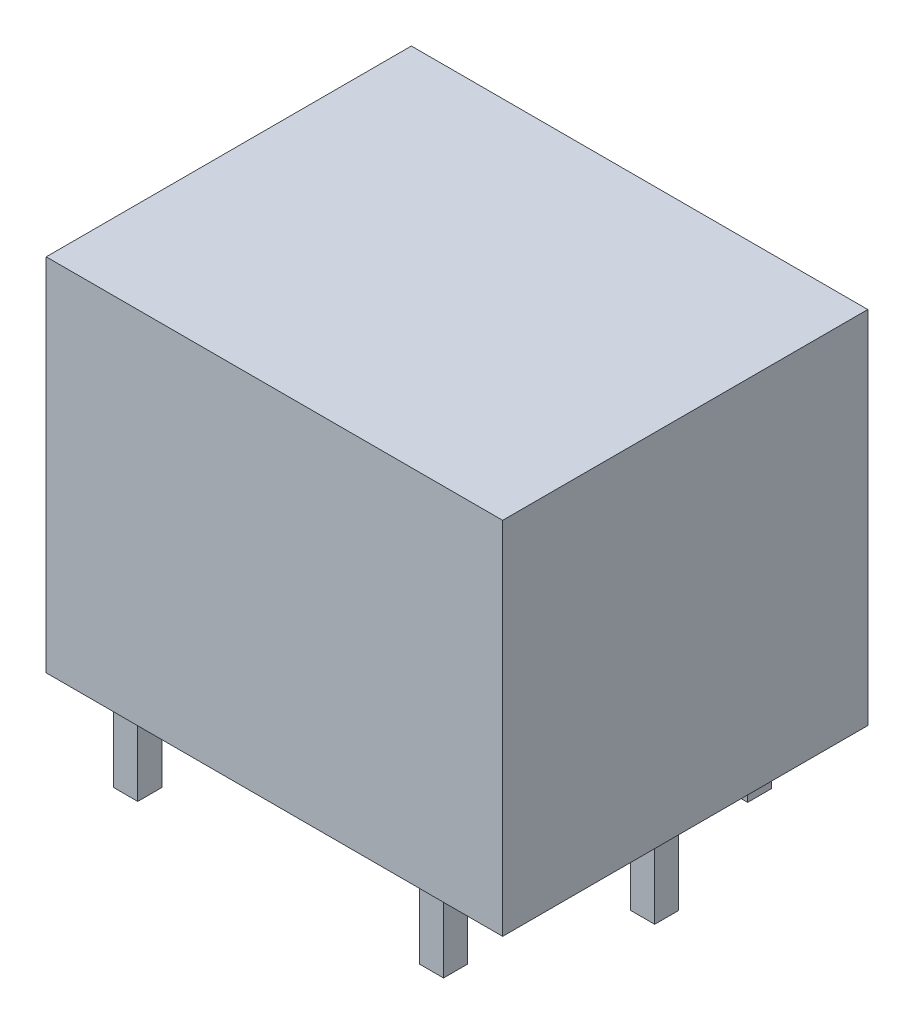
ISO-10303-21;
HEADER;
FILE_DESCRIPTION(('STEP AP214'),'2;1');
FILE_NAME('part.step','',(''),(''),'','','');
FILE_SCHEMA(('AUTOMOTIVE_DESIGN { 1 0 10303 214 1 1 1 1 }'));
ENDSEC;
DATA;
#1=APPLICATION_CONTEXT('core data for automotive mechanical design processes');
#2=APPLICATION_PROTOCOL_DEFINITION('international standard','automotive_design',2000,#1);
#3=PRODUCT_CONTEXT('',#1,'mechanical');
#4=PRODUCT('Part','Part','',(#3));
#5=PRODUCT_RELATED_PRODUCT_CATEGORY('part','',(#4));
#6=PRODUCT_DEFINITION_FORMATION('','',#4);
#7=PRODUCT_DEFINITION_CONTEXT('part definition',#1,'design');
#8=PRODUCT_DEFINITION('design','',#6,#7);
#9=PRODUCT_DEFINITION_SHAPE('','',#8);
#10=(LENGTH_UNIT() NAMED_UNIT(*) SI_UNIT(.MILLI.,.METRE.));
#11=(NAMED_UNIT(*) PLANE_ANGLE_UNIT() SI_UNIT($,.RADIAN.));
#12=(NAMED_UNIT(*) SI_UNIT($,.STERADIAN.) SOLID_ANGLE_UNIT());
#13=UNCERTAINTY_MEASURE_WITH_UNIT(LENGTH_MEASURE(1.E-05),#10,'distance_accuracy_value','');
#14=(GEOMETRIC_REPRESENTATION_CONTEXT(3) GLOBAL_UNCERTAINTY_ASSIGNED_CONTEXT((#13)) GLOBAL_UNIT_ASSIGNED_CONTEXT((#10,
#11,#12)) REPRESENTATION_CONTEXT('',''));
#15=CARTESIAN_POINT('',(0.,0.,0.));
#16=DIRECTION('',(0.,0.,1.));
#17=DIRECTION('',(1.,0.,0.));
#18=AXIS2_PLACEMENT_3D('',#15,#16,#17);
#19=CARTESIAN_POINT('',(-9.49999999999999,0.,7.6));
#20=DIRECTION('',(0.,1.,0.));
#21=DIRECTION('',(0.,0.,1.));
#22=AXIS2_PLACEMENT_3D('',#19,#20,#21);
#23=PLANE('',#22);
#24=DIRECTION('',(1.,0.,0.));
#25=VECTOR('',#24,1.);
#26=CARTESIAN_POINT('',(-6.45999999999999,0.,-6.83));
#27=LINE('',#26,#25);
#28=CARTESIAN_POINT('',(-7.45999999999999,0.,-6.83));
#29=VERTEX_POINT('',#28);
#30=CARTESIAN_POINT('',(-6.45999999999999,0.,-6.83));
#31=VERTEX_POINT('',#30);
#32=EDGE_CURVE('E221',#29,#31,#27,.T.);
#33=ORIENTED_EDGE('',*,*,#32,.F.);
#34=DIRECTION('',(0.,0.,-1.));
#35=VECTOR('',#34,1.);
#36=CARTESIAN_POINT('',(-7.45999999999999,0.,-6.83));
#37=LINE('',#36,#35);
#38=CARTESIAN_POINT('',(-7.45999999999999,0.,-5.83));
#39=VERTEX_POINT('',#38);
#40=EDGE_CURVE('E230',#39,#29,#37,.T.);
#41=ORIENTED_EDGE('',*,*,#40,.F.);
#42=DIRECTION('',(-1.,0.,0.));
#43=VECTOR('',#42,1.);
#44=CARTESIAN_POINT('',(-6.45999999999999,0.,-5.83));
#45=LINE('',#44,#43);
#46=CARTESIAN_POINT('',(-6.45999999999999,0.,-5.83));
#47=VERTEX_POINT('',#46);
#48=EDGE_CURVE('E227',#47,#39,#45,.T.);
#49=ORIENTED_EDGE('',*,*,#48,.F.);
#50=DIRECTION('',(0.,0.,1.));
#51=VECTOR('',#50,1.);
#52=CARTESIAN_POINT('',(-6.45999999999999,0.,-6.83));
#53=LINE('',#52,#51);
#54=EDGE_CURVE('E224',#31,#47,#53,.T.);
#55=ORIENTED_EDGE('',*,*,#54,.F.);
#56=EDGE_LOOP('',(#33,#41,#49,#55));
#57=FACE_BOUND('',#56,.T.);
#58=DIRECTION('',(0.,0.,1.));
#59=VECTOR('',#58,1.);
#60=CARTESIAN_POINT('',(6.27000000000001,0.,6.83));
#61=LINE('',#60,#59);
#62=CARTESIAN_POINT('',(6.27000000000001,0.,5.83));
#63=VERTEX_POINT('',#62);
#64=CARTESIAN_POINT('',(6.27,0.,6.83));
#65=VERTEX_POINT('',#64);
#66=EDGE_CURVE('E287',#63,#65,#61,.T.);
#67=ORIENTED_EDGE('',*,*,#66,.F.);
#68=DIRECTION('',(1.,0.,0.));
#69=VECTOR('',#68,1.);
#70=CARTESIAN_POINT('',(6.27000000000001,0.,5.83));
#71=LINE('',#70,#69);
#72=CARTESIAN_POINT('',(5.27000000000001,0.,5.83));
#73=VERTEX_POINT('',#72);
#74=EDGE_CURVE('E296',#73,#63,#71,.T.);
#75=ORIENTED_EDGE('',*,*,#74,.F.);
#76=DIRECTION('',(0.,0.,-1.));
#77=VECTOR('',#76,1.);
#78=CARTESIAN_POINT('',(5.27000000000001,0.,6.83));
#79=LINE('',#78,#77);
#80=CARTESIAN_POINT('',(5.27,0.,6.83));
#81=VERTEX_POINT('',#80);
#82=EDGE_CURVE('E293',#81,#73,#79,.T.);
#83=ORIENTED_EDGE('',*,*,#82,.F.);
#84=DIRECTION('',(-1.,0.,0.));
#85=VECTOR('',#84,1.);
#86=CARTESIAN_POINT('',(6.27000000000001,0.,6.83));
#87=LINE('',#86,#85);
#88=EDGE_CURVE('E290',#65,#81,#87,.T.);
#89=ORIENTED_EDGE('',*,*,#88,.F.);
#90=EDGE_LOOP('',(#67,#75,#83,#89));
#91=FACE_BOUND('',#90,.T.);
#92=DIRECTION('',(0.,0.,1.));
#93=VECTOR('',#92,1.);
#94=CARTESIAN_POINT('',(-9.49999999999999,0.,-7.6));
#95=LINE('',#94,#93);
#96=CARTESIAN_POINT('',(-9.49999999999999,0.,-7.6));
#97=VERTEX_POINT('',#96);
#98=CARTESIAN_POINT('',(-9.49999999999999,0.,7.6));
#99=VERTEX_POINT('',#98);
#100=EDGE_CURVE('E353',#97,#99,#95,.T.);
#101=ORIENTED_EDGE('',*,*,#100,.F.);
#102=DIRECTION('',(-1.,0.,0.));
#103=VECTOR('',#102,1.);
#104=CARTESIAN_POINT('',(-9.49999999999999,0.,-7.6));
#105=LINE('',#104,#103);
#106=CARTESIAN_POINT('',(9.5,0.,-7.6));
#107=VERTEX_POINT('',#106);
#108=EDGE_CURVE('E360',#107,#97,#105,.T.);
#109=ORIENTED_EDGE('',*,*,#108,.F.);
#110=DIRECTION('',(0.,0.,-1.));
#111=VECTOR('',#110,1.);
#112=CARTESIAN_POINT('',(9.5,0.,-7.6));
#113=LINE('',#112,#111);
#114=CARTESIAN_POINT('',(9.50000000000001,0.,7.6));
#115=VERTEX_POINT('',#114);
#116=EDGE_CURVE('E358',#115,#107,#113,.T.);
#117=ORIENTED_EDGE('',*,*,#116,.F.);
#118=DIRECTION('',(1.,0.,0.));
#119=VECTOR('',#118,1.);
#120=CARTESIAN_POINT('',(-9.49999999999999,0.,7.6));
#121=LINE('',#120,#119);
#122=EDGE_CURVE('E356',#99,#115,#121,.T.);
#123=ORIENTED_EDGE('',*,*,#122,.F.);
#124=EDGE_LOOP('',(#101,#109,#117,#123));
#125=FACE_BOUND('',#124,.T.);
#126=DIRECTION('',(0.,0.,1.));
#127=VECTOR('',#126,1.);
#128=CARTESIAN_POINT('',(8.73000000000001,0.,-0.499999999999999));
#129=LINE('',#128,#127);
#130=CARTESIAN_POINT('',(8.73000000000001,0.,-0.499999999999999));
#131=VERTEX_POINT('',#130);
#132=CARTESIAN_POINT('',(8.73,0.,0.500000000000008));
#133=VERTEX_POINT('',#132);
#134=EDGE_CURVE('E320',#131,#133,#129,.T.);
#135=ORIENTED_EDGE('',*,*,#134,.F.);
#136=DIRECTION('',(1.,0.,0.));
#137=VECTOR('',#136,1.);
#138=CARTESIAN_POINT('',(8.73000000000001,0.,-0.499999999999999));
#139=LINE('',#138,#137);
#140=CARTESIAN_POINT('',(7.73,0.,-0.5));
#141=VERTEX_POINT('',#140);
#142=EDGE_CURVE('E329',#141,#131,#139,.T.);
#143=ORIENTED_EDGE('',*,*,#142,.F.);
#144=DIRECTION('',(0.,0.,-1.));
#145=VECTOR('',#144,1.);
#146=CARTESIAN_POINT('',(7.73,0.,-0.499999999999999));
#147=LINE('',#146,#145);
#148=CARTESIAN_POINT('',(7.73,0.,0.500000000000008));
#149=VERTEX_POINT('',#148);
#150=EDGE_CURVE('E326',#149,#141,#147,.T.);
#151=ORIENTED_EDGE('',*,*,#150,.F.);
#152=DIRECTION('',(-1.,0.,0.));
#153=VECTOR('',#152,1.);
#154=CARTESIAN_POINT('',(8.73000000000001,0.,0.500000000000008));
#155=LINE('',#154,#153);
#156=EDGE_CURVE('E323',#133,#149,#155,.T.);
#157=ORIENTED_EDGE('',*,*,#156,.F.);
#158=EDGE_LOOP('',(#135,#143,#151,#157));
#159=FACE_BOUND('',#158,.T.);
#160=DIRECTION('',(0.,0.,1.));
#161=VECTOR('',#160,1.);
#162=CARTESIAN_POINT('',(-6.45999999999999,0.,6.83));
#163=LINE('',#162,#161);
#164=CARTESIAN_POINT('',(-6.45999999999999,0.,5.83));
#165=VERTEX_POINT('',#164);
#166=CARTESIAN_POINT('',(-6.45999999999999,0.,6.83));
#167=VERTEX_POINT('',#166);
#168=EDGE_CURVE('E254',#165,#167,#163,.T.);
#169=ORIENTED_EDGE('',*,*,#168,.F.);
#170=DIRECTION('',(1.,0.,0.));
#171=VECTOR('',#170,1.);
#172=CARTESIAN_POINT('',(-6.45999999999999,0.,5.83));
#173=LINE('',#172,#171);
#174=CARTESIAN_POINT('',(-7.45999999999999,0.,5.83));
#175=VERTEX_POINT('',#174);
#176=EDGE_CURVE('E263',#175,#165,#173,.T.);
#177=ORIENTED_EDGE('',*,*,#176,.F.);
#178=DIRECTION('',(0.,0.,-1.));
#179=VECTOR('',#178,1.);
#180=CARTESIAN_POINT('',(-7.45999999999999,0.,6.83));
#181=LINE('',#180,#179);
#182=CARTESIAN_POINT('',(-7.45999999999999,0.,6.83));
#183=VERTEX_POINT('',#182);
#184=EDGE_CURVE('E260',#183,#175,#181,.T.);
#185=ORIENTED_EDGE('',*,*,#184,.F.);
#186=DIRECTION('',(-1.,0.,0.));
#187=VECTOR('',#186,1.);
#188=CARTESIAN_POINT('',(-6.45999999999999,0.,6.83));
#189=LINE('',#188,#187);
#190=EDGE_CURVE('E257',#167,#183,#189,.T.);
#191=ORIENTED_EDGE('',*,*,#190,.F.);
#192=EDGE_LOOP('',(#169,#177,#185,#191));
#193=FACE_BOUND('',#192,.T.);
#194=DIRECTION('',(1.,0.,0.));
#195=VECTOR('',#194,1.);
#196=CARTESIAN_POINT('',(6.27000000000001,0.,-6.83));
#197=LINE('',#196,#195);
#198=CARTESIAN_POINT('',(5.27000000000001,0.,-6.83));
#199=VERTEX_POINT('',#198);
#200=CARTESIAN_POINT('',(6.27,0.,-6.83));
#201=VERTEX_POINT('',#200);
#202=EDGE_CURVE('E189',#199,#201,#197,.T.);
#203=ORIENTED_EDGE('',*,*,#202,.F.);
#204=DIRECTION('',(0.,0.,-1.));
#205=VECTOR('',#204,1.);
#206=CARTESIAN_POINT('',(5.27000000000001,0.,-6.83));
#207=LINE('',#206,#205);
#208=CARTESIAN_POINT('',(5.27,0.,-5.83));
#209=VERTEX_POINT('',#208);
#210=EDGE_CURVE('E191',#209,#199,#207,.T.);
#211=ORIENTED_EDGE('',*,*,#210,.F.);
#212=DIRECTION('',(-1.,0.,0.));
#213=VECTOR('',#212,1.);
#214=CARTESIAN_POINT('',(6.27000000000001,0.,-5.83));
#215=LINE('',#214,#213);
#216=CARTESIAN_POINT('',(6.27,0.,-5.83));
#217=VERTEX_POINT('',#216);
#218=EDGE_CURVE('E52',#217,#209,#215,.T.);
#219=ORIENTED_EDGE('',*,*,#218,.F.);
#220=DIRECTION('',(0.,0.,1.));
#221=VECTOR('',#220,1.);
#222=CARTESIAN_POINT('',(6.27000000000001,0.,-6.83));
#223=LINE('',#222,#221);
#224=EDGE_CURVE('E47',#201,#217,#223,.T.);
#225=ORIENTED_EDGE('',*,*,#224,.F.);
#226=EDGE_LOOP('',(#203,#211,#219,#225));
#227=FACE_BOUND('',#226,.T.);
#228=ADVANCED_FACE('F32',(#57,#91,#125,#159,#193,#227),#23,.F.);
#229=CARTESIAN_POINT('',(-9.49999999999999,15.,-7.6));
#230=DIRECTION('',(1.,0.,0.));
#231=DIRECTION('',(0.,0.,-1.));
#232=AXIS2_PLACEMENT_3D('',#229,#230,#231);
#233=PLANE('',#232);
#234=ORIENTED_EDGE('',*,*,#100,.T.);
#235=DIRECTION('',(0.,-1.,0.));
#236=VECTOR('',#235,1.);
#237=CARTESIAN_POINT('',(-9.49999999999999,15.,7.6));
#238=LINE('',#237,#236);
#239=CARTESIAN_POINT('',(-9.49999999999999,15.,7.6));
#240=VERTEX_POINT('',#239);
#241=EDGE_CURVE('E11',#240,#99,#238,.T.);
#242=ORIENTED_EDGE('',*,*,#241,.F.);
#243=DIRECTION('',(0.,0.,1.));
#244=VECTOR('',#243,1.);
#245=CARTESIAN_POINT('',(-9.49999999999999,15.,-7.6));
#246=LINE('',#245,#244);
#247=CARTESIAN_POINT('',(-9.49999999999999,15.,-7.6));
#248=VERTEX_POINT('',#247);
#249=EDGE_CURVE('E362',#248,#240,#246,.T.);
#250=ORIENTED_EDGE('',*,*,#249,.F.);
#251=DIRECTION('',(0.,-1.,0.));
#252=VECTOR('',#251,1.);
#253=CARTESIAN_POINT('',(-9.49999999999999,15.,-7.6));
#254=LINE('',#253,#252);
#255=EDGE_CURVE('E371',#248,#97,#254,.T.);
#256=ORIENTED_EDGE('',*,*,#255,.T.);
#257=EDGE_LOOP('',(#234,#242,#250,#256));
#258=FACE_BOUND('',#257,.T.);
#259=ADVANCED_FACE('F34',(#258),#233,.F.);
#260=CARTESIAN_POINT('',(-9.49999999999999,15.,7.6));
#261=DIRECTION('',(0.,0.,-1.));
#262=DIRECTION('',(-1.,0.,0.));
#263=AXIS2_PLACEMENT_3D('',#260,#261,#262);
#264=PLANE('',#263);
#265=ORIENTED_EDGE('',*,*,#122,.T.);
#266=DIRECTION('',(0.,-1.,0.));
#267=VECTOR('',#266,1.);
#268=CARTESIAN_POINT('',(9.50000000000001,15.,7.6));
#269=LINE('',#268,#267);
#270=CARTESIAN_POINT('',(9.50000000000001,15.,7.6));
#271=VERTEX_POINT('',#270);
#272=EDGE_CURVE('E40',#271,#115,#269,.T.);
#273=ORIENTED_EDGE('',*,*,#272,.F.);
#274=DIRECTION('',(1.,0.,0.));
#275=VECTOR('',#274,1.);
#276=CARTESIAN_POINT('',(-9.49999999999999,15.,7.6));
#277=LINE('',#276,#275);
#278=EDGE_CURVE('E365',#240,#271,#277,.T.);
#279=ORIENTED_EDGE('',*,*,#278,.F.);
#280=ORIENTED_EDGE('',*,*,#241,.T.);
#281=EDGE_LOOP('',(#265,#273,#279,#280));
#282=FACE_BOUND('',#281,.T.);
#283=ADVANCED_FACE('F397',(#282),#264,.F.);
#284=CARTESIAN_POINT('',(9.5,15.,-7.6));
#285=DIRECTION('',(-1.,0.,0.));
#286=DIRECTION('',(0.,0.,1.));
#287=AXIS2_PLACEMENT_3D('',#284,#285,#286);
#288=PLANE('',#287);
#289=ORIENTED_EDGE('',*,*,#116,.T.);
#290=DIRECTION('',(0.,-1.,0.));
#291=VECTOR('',#290,1.);
#292=CARTESIAN_POINT('',(9.5,15.,-7.6));
#293=LINE('',#292,#291);
#294=CARTESIAN_POINT('',(9.5,15.,-7.6));
#295=VERTEX_POINT('',#294);
#296=EDGE_CURVE('E374',#295,#107,#293,.T.);
#297=ORIENTED_EDGE('',*,*,#296,.F.);
#298=DIRECTION('',(0.,0.,-1.));
#299=VECTOR('',#298,1.);
#300=CARTESIAN_POINT('',(9.5,15.,-7.6));
#301=LINE('',#300,#299);
#302=EDGE_CURVE('E367',#271,#295,#301,.T.);
#303=ORIENTED_EDGE('',*,*,#302,.F.);
#304=ORIENTED_EDGE('',*,*,#272,.T.);
#305=EDGE_LOOP('',(#289,#297,#303,#304));
#306=FACE_BOUND('',#305,.T.);
#307=ADVANCED_FACE('F381',(#306),#288,.F.);
#308=CARTESIAN_POINT('',(-9.49999999999999,15.,-7.6));
#309=DIRECTION('',(0.,0.,1.));
#310=DIRECTION('',(1.,0.,0.));
#311=AXIS2_PLACEMENT_3D('',#308,#309,#310);
#312=PLANE('',#311);
#313=ORIENTED_EDGE('',*,*,#108,.T.);
#314=ORIENTED_EDGE('',*,*,#255,.F.);
#315=DIRECTION('',(-1.,0.,0.));
#316=VECTOR('',#315,1.);
#317=CARTESIAN_POINT('',(-9.49999999999999,15.,-7.6));
#318=LINE('',#317,#316);
#319=EDGE_CURVE('E369',#295,#248,#318,.T.);
#320=ORIENTED_EDGE('',*,*,#319,.F.);
#321=ORIENTED_EDGE('',*,*,#296,.T.);
#322=EDGE_LOOP('',(#313,#314,#320,#321));
#323=FACE_BOUND('',#322,.T.);
#324=ADVANCED_FACE('F390',(#323),#312,.F.);
#325=CARTESIAN_POINT('',(-9.49999999999999,15.,7.6));
#326=DIRECTION('',(0.,1.,0.));
#327=DIRECTION('',(0.,0.,1.));
#328=AXIS2_PLACEMENT_3D('',#325,#326,#327);
#329=PLANE('',#328);
#330=ORIENTED_EDGE('',*,*,#249,.T.);
#331=ORIENTED_EDGE('',*,*,#278,.T.);
#332=ORIENTED_EDGE('',*,*,#302,.T.);
#333=ORIENTED_EDGE('',*,*,#319,.T.);
#334=EDGE_LOOP('',(#330,#331,#332,#333));
#335=FACE_BOUND('',#334,.T.);
#336=ADVANCED_FACE('F396',(#335),#329,.T.);
#337=CARTESIAN_POINT('',(8.73000000000001,-3.5,-0.499999999999999));
#338=DIRECTION('',(-1.,0.,0.));
#339=DIRECTION('',(0.,0.,1.));
#340=AXIS2_PLACEMENT_3D('',#337,#338,#339);
#341=PLANE('',#340);
#342=ORIENTED_EDGE('',*,*,#134,.T.);
#343=DIRECTION('',(0.,1.,0.));
#344=VECTOR('',#343,1.);
#345=CARTESIAN_POINT('',(8.73000000000001,-3.5,0.500000000000008));
#346=LINE('',#345,#344);
#347=CARTESIAN_POINT('',(8.73000000000001,-3.5,0.500000000000008));
#348=VERTEX_POINT('',#347);
#349=EDGE_CURVE('E350',#348,#133,#346,.T.);
#350=ORIENTED_EDGE('',*,*,#349,.F.);
#351=DIRECTION('',(0.,0.,1.));
#352=VECTOR('',#351,1.);
#353=CARTESIAN_POINT('',(8.73000000000001,-3.5,-0.499999999999999));
#354=LINE('',#353,#352);
#355=CARTESIAN_POINT('',(8.73000000000001,-3.5,-0.499999999999999));
#356=VERTEX_POINT('',#355);
#357=EDGE_CURVE('E332',#356,#348,#354,.T.);
#358=ORIENTED_EDGE('',*,*,#357,.F.);
#359=DIRECTION('',(0.,1.,0.));
#360=VECTOR('',#359,1.);
#361=CARTESIAN_POINT('',(8.73000000000001,-3.5,-0.499999999999999));
#362=LINE('',#361,#360);
#363=EDGE_CURVE('E341',#356,#131,#362,.T.);
#364=ORIENTED_EDGE('',*,*,#363,.T.);
#365=EDGE_LOOP('',(#342,#350,#358,#364));
#366=FACE_BOUND('',#365,.T.);
#367=ADVANCED_FACE('F412',(#366),#341,.F.);
#368=CARTESIAN_POINT('',(8.73000000000001,-3.5,0.500000000000008));
#369=DIRECTION('',(0.,0.,-1.));
#370=DIRECTION('',(-1.,0.,0.));
#371=AXIS2_PLACEMENT_3D('',#368,#369,#370);
#372=PLANE('',#371);
#373=ORIENTED_EDGE('',*,*,#156,.T.);
#374=DIRECTION('',(0.,1.,0.));
#375=VECTOR('',#374,1.);
#376=CARTESIAN_POINT('',(7.73000000000001,-3.5,0.500000000000008));
#377=LINE('',#376,#375);
#378=CARTESIAN_POINT('',(7.73000000000001,-3.5,0.500000000000008));
#379=VERTEX_POINT('',#378);
#380=EDGE_CURVE('E347',#379,#149,#377,.T.);
#381=ORIENTED_EDGE('',*,*,#380,.F.);
#382=DIRECTION('',(-1.,0.,0.));
#383=VECTOR('',#382,1.);
#384=CARTESIAN_POINT('',(8.73000000000001,-3.5,0.500000000000008));
#385=LINE('',#384,#383);
#386=EDGE_CURVE('E335',#348,#379,#385,.T.);
#387=ORIENTED_EDGE('',*,*,#386,.F.);
#388=ORIENTED_EDGE('',*,*,#349,.T.);
#389=EDGE_LOOP('',(#373,#381,#387,#388));
#390=FACE_BOUND('',#389,.T.);
#391=ADVANCED_FACE('F431',(#390),#372,.F.);
#392=CARTESIAN_POINT('',(7.73,-3.5,-0.499999999999999));
#393=DIRECTION('',(1.,0.,0.));
#394=DIRECTION('',(0.,0.,-1.));
#395=AXIS2_PLACEMENT_3D('',#392,#393,#394);
#396=PLANE('',#395);
#397=ORIENTED_EDGE('',*,*,#150,.T.);
#398=DIRECTION('',(0.,1.,0.));
#399=VECTOR('',#398,1.);
#400=CARTESIAN_POINT('',(7.73,-3.5,-0.499999999999999));
#401=LINE('',#400,#399);
#402=CARTESIAN_POINT('',(7.73,-3.5,-0.499999999999999));
#403=VERTEX_POINT('',#402);
#404=EDGE_CURVE('E344',#403,#141,#401,.T.);
#405=ORIENTED_EDGE('',*,*,#404,.F.);
#406=DIRECTION('',(0.,0.,-1.));
#407=VECTOR('',#406,1.);
#408=CARTESIAN_POINT('',(7.73,-3.5,-0.499999999999999));
#409=LINE('',#408,#407);
#410=EDGE_CURVE('E337',#379,#403,#409,.T.);
#411=ORIENTED_EDGE('',*,*,#410,.F.);
#412=ORIENTED_EDGE('',*,*,#380,.T.);
#413=EDGE_LOOP('',(#397,#405,#411,#412));
#414=FACE_BOUND('',#413,.T.);
#415=ADVANCED_FACE('F438',(#414),#396,.F.);
#416=CARTESIAN_POINT('',(8.73000000000001,-3.5,-0.499999999999999));
#417=DIRECTION('',(0.,0.,1.));
#418=DIRECTION('',(1.,0.,0.));
#419=AXIS2_PLACEMENT_3D('',#416,#417,#418);
#420=PLANE('',#419);
#421=ORIENTED_EDGE('',*,*,#142,.T.);
#422=ORIENTED_EDGE('',*,*,#363,.F.);
#423=DIRECTION('',(1.,0.,0.));
#424=VECTOR('',#423,1.);
#425=CARTESIAN_POINT('',(8.73000000000001,-3.5,-0.499999999999999));
#426=LINE('',#425,#424);
#427=EDGE_CURVE('E339',#403,#356,#426,.T.);
#428=ORIENTED_EDGE('',*,*,#427,.F.);
#429=ORIENTED_EDGE('',*,*,#404,.T.);
#430=EDGE_LOOP('',(#421,#422,#428,#429));
#431=FACE_BOUND('',#430,.T.);
#432=ADVANCED_FACE('F445',(#431),#420,.F.);
#433=CARTESIAN_POINT('',(8.73000000000001,-3.5,0.500000000000008));
#434=DIRECTION('',(0.,-1.,0.));
#435=DIRECTION('',(0.,0.,-1.));
#436=AXIS2_PLACEMENT_3D('',#433,#434,#435);
#437=PLANE('',#436);
#438=ORIENTED_EDGE('',*,*,#357,.T.);
#439=ORIENTED_EDGE('',*,*,#386,.T.);
#440=ORIENTED_EDGE('',*,*,#410,.T.);
#441=ORIENTED_EDGE('',*,*,#427,.T.);
#442=EDGE_LOOP('',(#438,#439,#440,#441));
#443=FACE_BOUND('',#442,.T.);
#444=ADVANCED_FACE('F453',(#443),#437,.T.);
#445=CARTESIAN_POINT('',(6.27000000000001,-3.5,6.83));
#446=DIRECTION('',(-1.,0.,0.));
#447=DIRECTION('',(0.,0.,1.));
#448=AXIS2_PLACEMENT_3D('',#445,#446,#447);
#449=PLANE('',#448);
#450=ORIENTED_EDGE('',*,*,#66,.T.);
#451=DIRECTION('',(0.,1.,0.));
#452=VECTOR('',#451,1.);
#453=CARTESIAN_POINT('',(6.27000000000001,-3.5,6.83));
#454=LINE('',#453,#452);
#455=CARTESIAN_POINT('',(6.27000000000001,-3.5,6.83));
#456=VERTEX_POINT('',#455);
#457=EDGE_CURVE('E317',#456,#65,#454,.T.);
#458=ORIENTED_EDGE('',*,*,#457,.F.);
#459=DIRECTION('',(0.,0.,1.));
#460=VECTOR('',#459,1.);
#461=CARTESIAN_POINT('',(6.27000000000001,-3.5,6.83));
#462=LINE('',#461,#460);
#463=CARTESIAN_POINT('',(6.27000000000001,-3.5,5.83));
#464=VERTEX_POINT('',#463);
#465=EDGE_CURVE('E299',#464,#456,#462,.T.);
#466=ORIENTED_EDGE('',*,*,#465,.F.);
#467=DIRECTION('',(0.,1.,0.));
#468=VECTOR('',#467,1.);
#469=CARTESIAN_POINT('',(6.27000000000001,-3.5,5.83));
#470=LINE('',#469,#468);
#471=EDGE_CURVE('E308',#464,#63,#470,.T.);
#472=ORIENTED_EDGE('',*,*,#471,.T.);
#473=EDGE_LOOP('',(#450,#458,#466,#472));
#474=FACE_BOUND('',#473,.T.);
#475=ADVANCED_FACE('F461',(#474),#449,.F.);
#476=CARTESIAN_POINT('',(6.27000000000001,-3.5,6.83));
#477=DIRECTION('',(0.,0.,-1.));
#478=DIRECTION('',(-1.,0.,0.));
#479=AXIS2_PLACEMENT_3D('',#476,#477,#478);
#480=PLANE('',#479);
#481=ORIENTED_EDGE('',*,*,#88,.T.);
#482=DIRECTION('',(0.,1.,0.));
#483=VECTOR('',#482,1.);
#484=CARTESIAN_POINT('',(5.27000000000001,-3.5,6.83));
#485=LINE('',#484,#483);
#486=CARTESIAN_POINT('',(5.27000000000001,-3.5,6.83));
#487=VERTEX_POINT('',#486);
#488=EDGE_CURVE('E314',#487,#81,#485,.T.);
#489=ORIENTED_EDGE('',*,*,#488,.F.);
#490=DIRECTION('',(-1.,0.,0.));
#491=VECTOR('',#490,1.);
#492=CARTESIAN_POINT('',(6.27000000000001,-3.5,6.83));
#493=LINE('',#492,#491);
#494=EDGE_CURVE('E302',#456,#487,#493,.T.);
#495=ORIENTED_EDGE('',*,*,#494,.F.);
#496=ORIENTED_EDGE('',*,*,#457,.T.);
#497=EDGE_LOOP('',(#481,#489,#495,#496));
#498=FACE_BOUND('',#497,.T.);
#499=ADVANCED_FACE('F469',(#498),#480,.F.);
#500=CARTESIAN_POINT('',(5.27000000000001,-3.5,6.83));
#501=DIRECTION('',(1.,0.,0.));
#502=DIRECTION('',(0.,0.,-1.));
#503=AXIS2_PLACEMENT_3D('',#500,#501,#502);
#504=PLANE('',#503);
#505=ORIENTED_EDGE('',*,*,#82,.T.);
#506=DIRECTION('',(0.,1.,0.));
#507=VECTOR('',#506,1.);
#508=CARTESIAN_POINT('',(5.27,-3.5,5.83));
#509=LINE('',#508,#507);
#510=CARTESIAN_POINT('',(5.27,-3.5,5.83));
#511=VERTEX_POINT('',#510);
#512=EDGE_CURVE('E311',#511,#73,#509,.T.);
#513=ORIENTED_EDGE('',*,*,#512,.F.);
#514=DIRECTION('',(0.,0.,-1.));
#515=VECTOR('',#514,1.);
#516=CARTESIAN_POINT('',(5.27000000000001,-3.5,6.83));
#517=LINE('',#516,#515);
#518=EDGE_CURVE('E304',#487,#511,#517,.T.);
#519=ORIENTED_EDGE('',*,*,#518,.F.);
#520=ORIENTED_EDGE('',*,*,#488,.T.);
#521=EDGE_LOOP('',(#505,#513,#519,#520));
#522=FACE_BOUND('',#521,.T.);
#523=ADVANCED_FACE('F477',(#522),#504,.F.);
#524=CARTESIAN_POINT('',(6.27000000000001,-3.5,5.83));
#525=DIRECTION('',(0.,0.,1.));
#526=DIRECTION('',(1.,0.,0.));
#527=AXIS2_PLACEMENT_3D('',#524,#525,#526);
#528=PLANE('',#527);
#529=ORIENTED_EDGE('',*,*,#74,.T.);
#530=ORIENTED_EDGE('',*,*,#471,.F.);
#531=DIRECTION('',(1.,0.,0.));
#532=VECTOR('',#531,1.);
#533=CARTESIAN_POINT('',(6.27000000000001,-3.5,5.83));
#534=LINE('',#533,#532);
#535=EDGE_CURVE('E306',#511,#464,#534,.T.);
#536=ORIENTED_EDGE('',*,*,#535,.F.);
#537=ORIENTED_EDGE('',*,*,#512,.T.);
#538=EDGE_LOOP('',(#529,#530,#536,#537));
#539=FACE_BOUND('',#538,.T.);
#540=ADVANCED_FACE('F485',(#539),#528,.F.);
#541=CARTESIAN_POINT('',(6.27000000000001,-3.5,5.83));
#542=DIRECTION('',(0.,1.,0.));
#543=DIRECTION('',(0.,0.,1.));
#544=AXIS2_PLACEMENT_3D('',#541,#542,#543);
#545=PLANE('',#544);
#546=ORIENTED_EDGE('',*,*,#465,.T.);
#547=ORIENTED_EDGE('',*,*,#494,.T.);
#548=ORIENTED_EDGE('',*,*,#518,.T.);
#549=ORIENTED_EDGE('',*,*,#535,.T.);
#550=EDGE_LOOP('',(#546,#547,#548,#549));
#551=FACE_BOUND('',#550,.T.);
#552=ADVANCED_FACE('F493',(#551),#545,.F.);
#553=CARTESIAN_POINT('',(-6.45999999999999,-3.5,6.83));
#554=DIRECTION('',(-1.,0.,0.));
#555=DIRECTION('',(0.,0.,1.));
#556=AXIS2_PLACEMENT_3D('',#553,#554,#555);
#557=PLANE('',#556);
#558=ORIENTED_EDGE('',*,*,#168,.T.);
#559=DIRECTION('',(0.,1.,0.));
#560=VECTOR('',#559,1.);
#561=CARTESIAN_POINT('',(-6.45999999999999,-3.5,6.83));
#562=LINE('',#561,#560);
#563=CARTESIAN_POINT('',(-6.45999999999999,-3.5,6.83));
#564=VERTEX_POINT('',#563);
#565=EDGE_CURVE('E284',#564,#167,#562,.T.);
#566=ORIENTED_EDGE('',*,*,#565,.F.);
#567=DIRECTION('',(0.,0.,1.));
#568=VECTOR('',#567,1.);
#569=CARTESIAN_POINT('',(-6.45999999999999,-3.5,6.83));
#570=LINE('',#569,#568);
#571=CARTESIAN_POINT('',(-6.45999999999999,-3.5,5.83));
#572=VERTEX_POINT('',#571);
#573=EDGE_CURVE('E266',#572,#564,#570,.T.);
#574=ORIENTED_EDGE('',*,*,#573,.F.);
#575=DIRECTION('',(0.,1.,0.));
#576=VECTOR('',#575,1.);
#577=CARTESIAN_POINT('',(-6.45999999999999,-3.5,5.83));
#578=LINE('',#577,#576);
#579=EDGE_CURVE('E275',#572,#165,#578,.T.);
#580=ORIENTED_EDGE('',*,*,#579,.T.);
#581=EDGE_LOOP('',(#558,#566,#574,#580));
#582=FACE_BOUND('',#581,.T.);
#583=ADVANCED_FACE('F501',(#582),#557,.F.);
#584=CARTESIAN_POINT('',(-6.45999999999999,-3.5,6.83));
#585=DIRECTION('',(0.,0.,-1.));
#586=DIRECTION('',(-1.,0.,0.));
#587=AXIS2_PLACEMENT_3D('',#584,#585,#586);
#588=PLANE('',#587);
#589=ORIENTED_EDGE('',*,*,#190,.T.);
#590=DIRECTION('',(0.,1.,0.));
#591=VECTOR('',#590,1.);
#592=CARTESIAN_POINT('',(-7.45999999999999,-3.5,6.83));
#593=LINE('',#592,#591);
#594=CARTESIAN_POINT('',(-7.45999999999999,-3.5,6.83));
#595=VERTEX_POINT('',#594);
#596=EDGE_CURVE('E281',#595,#183,#593,.T.);
#597=ORIENTED_EDGE('',*,*,#596,.F.);
#598=DIRECTION('',(-1.,0.,0.));
#599=VECTOR('',#598,1.);
#600=CARTESIAN_POINT('',(-6.45999999999999,-3.5,6.83));
#601=LINE('',#600,#599);
#602=EDGE_CURVE('E269',#564,#595,#601,.T.);
#603=ORIENTED_EDGE('',*,*,#602,.F.);
#604=ORIENTED_EDGE('',*,*,#565,.T.);
#605=EDGE_LOOP('',(#589,#597,#603,#604));
#606=FACE_BOUND('',#605,.T.);
#607=ADVANCED_FACE('F509',(#606),#588,.F.);
#608=CARTESIAN_POINT('',(-7.45999999999999,-3.5,6.83));
#609=DIRECTION('',(1.,0.,0.));
#610=DIRECTION('',(0.,0.,-1.));
#611=AXIS2_PLACEMENT_3D('',#608,#609,#610);
#612=PLANE('',#611);
#613=ORIENTED_EDGE('',*,*,#184,.T.);
#614=DIRECTION('',(0.,1.,0.));
#615=VECTOR('',#614,1.);
#616=CARTESIAN_POINT('',(-7.45999999999999,-3.5,5.83));
#617=LINE('',#616,#615);
#618=CARTESIAN_POINT('',(-7.45999999999999,-3.5,5.83));
#619=VERTEX_POINT('',#618);
#620=EDGE_CURVE('E278',#619,#175,#617,.T.);
#621=ORIENTED_EDGE('',*,*,#620,.F.);
#622=DIRECTION('',(0.,0.,-1.));
#623=VECTOR('',#622,1.);
#624=CARTESIAN_POINT('',(-7.45999999999999,-3.5,6.83));
#625=LINE('',#624,#623);
#626=EDGE_CURVE('E271',#595,#619,#625,.T.);
#627=ORIENTED_EDGE('',*,*,#626,.F.);
#628=ORIENTED_EDGE('',*,*,#596,.T.);
#629=EDGE_LOOP('',(#613,#621,#627,#628));
#630=FACE_BOUND('',#629,.T.);
#631=ADVANCED_FACE('F517',(#630),#612,.F.);
#632=CARTESIAN_POINT('',(-6.45999999999999,-3.5,5.83));
#633=DIRECTION('',(0.,0.,1.));
#634=DIRECTION('',(1.,0.,0.));
#635=AXIS2_PLACEMENT_3D('',#632,#633,#634);
#636=PLANE('',#635);
#637=ORIENTED_EDGE('',*,*,#176,.T.);
#638=ORIENTED_EDGE('',*,*,#579,.F.);
#639=DIRECTION('',(1.,0.,0.));
#640=VECTOR('',#639,1.);
#641=CARTESIAN_POINT('',(-6.45999999999999,-3.5,5.83));
#642=LINE('',#641,#640);
#643=EDGE_CURVE('E273',#619,#572,#642,.T.);
#644=ORIENTED_EDGE('',*,*,#643,.F.);
#645=ORIENTED_EDGE('',*,*,#620,.T.);
#646=EDGE_LOOP('',(#637,#638,#644,#645));
#647=FACE_BOUND('',#646,.T.);
#648=ADVANCED_FACE('F525',(#647),#636,.F.);
#649=CARTESIAN_POINT('',(-6.45999999999999,-3.5,5.83));
#650=DIRECTION('',(0.,1.,0.));
#651=DIRECTION('',(0.,0.,1.));
#652=AXIS2_PLACEMENT_3D('',#649,#650,#651);
#653=PLANE('',#652);
#654=ORIENTED_EDGE('',*,*,#573,.T.);
#655=ORIENTED_EDGE('',*,*,#602,.T.);
#656=ORIENTED_EDGE('',*,*,#626,.T.);
#657=ORIENTED_EDGE('',*,*,#643,.T.);
#658=EDGE_LOOP('',(#654,#655,#656,#657));
#659=FACE_BOUND('',#658,.T.);
#660=ADVANCED_FACE('F533',(#659),#653,.F.);
#661=CARTESIAN_POINT('',(-6.45999999999999,-3.5,-6.83));
#662=DIRECTION('',(0.,0.,1.));
#663=DIRECTION('',(1.,0.,0.));
#664=AXIS2_PLACEMENT_3D('',#661,#662,#663);
#665=PLANE('',#664);
#666=ORIENTED_EDGE('',*,*,#32,.T.);
#667=DIRECTION('',(0.,1.,0.));
#668=VECTOR('',#667,1.);
#669=CARTESIAN_POINT('',(-6.45999999999999,-3.5,-6.83));
#670=LINE('',#669,#668);
#671=CARTESIAN_POINT('',(-6.45999999999999,-3.5,-6.83));
#672=VERTEX_POINT('',#671);
#673=EDGE_CURVE('E251',#672,#31,#670,.T.);
#674=ORIENTED_EDGE('',*,*,#673,.F.);
#675=DIRECTION('',(1.,0.,0.));
#676=VECTOR('',#675,1.);
#677=CARTESIAN_POINT('',(-6.45999999999999,-3.5,-6.83));
#678=LINE('',#677,#676);
#679=CARTESIAN_POINT('',(-7.45999999999999,-3.5,-6.83));
#680=VERTEX_POINT('',#679);
#681=EDGE_CURVE('E233',#680,#672,#678,.T.);
#682=ORIENTED_EDGE('',*,*,#681,.F.);
#683=DIRECTION('',(0.,1.,0.));
#684=VECTOR('',#683,1.);
#685=CARTESIAN_POINT('',(-7.45999999999999,-3.5,-6.83));
#686=LINE('',#685,#684);
#687=EDGE_CURVE('E242',#680,#29,#686,.T.);
#688=ORIENTED_EDGE('',*,*,#687,.T.);
#689=EDGE_LOOP('',(#666,#674,#682,#688));
#690=FACE_BOUND('',#689,.T.);
#691=ADVANCED_FACE('F541',(#690),#665,.F.);
#692=CARTESIAN_POINT('',(-6.45999999999999,-3.5,-6.83));
#693=DIRECTION('',(-1.,0.,0.));
#694=DIRECTION('',(0.,0.,1.));
#695=AXIS2_PLACEMENT_3D('',#692,#693,#694);
#696=PLANE('',#695);
#697=ORIENTED_EDGE('',*,*,#54,.T.);
#698=DIRECTION('',(0.,1.,0.));
#699=VECTOR('',#698,1.);
#700=CARTESIAN_POINT('',(-6.45999999999999,-3.5,-5.83));
#701=LINE('',#700,#699);
#702=CARTESIAN_POINT('',(-6.45999999999999,-3.5,-5.83));
#703=VERTEX_POINT('',#702);
#704=EDGE_CURVE('E248',#703,#47,#701,.T.);
#705=ORIENTED_EDGE('',*,*,#704,.F.);
#706=DIRECTION('',(0.,0.,1.));
#707=VECTOR('',#706,1.);
#708=CARTESIAN_POINT('',(-6.45999999999999,-3.5,-6.83));
#709=LINE('',#708,#707);
#710=EDGE_CURVE('E236',#672,#703,#709,.T.);
#711=ORIENTED_EDGE('',*,*,#710,.F.);
#712=ORIENTED_EDGE('',*,*,#673,.T.);
#713=EDGE_LOOP('',(#697,#705,#711,#712));
#714=FACE_BOUND('',#713,.T.);
#715=ADVANCED_FACE('F549',(#714),#696,.F.);
#716=CARTESIAN_POINT('',(-6.45999999999999,-3.5,-5.83));
#717=DIRECTION('',(0.,0.,-1.));
#718=DIRECTION('',(-1.,0.,0.));
#719=AXIS2_PLACEMENT_3D('',#716,#717,#718);
#720=PLANE('',#719);
#721=ORIENTED_EDGE('',*,*,#48,.T.);
#722=DIRECTION('',(0.,1.,0.));
#723=VECTOR('',#722,1.);
#724=CARTESIAN_POINT('',(-7.45999999999999,-3.5,-5.83));
#725=LINE('',#724,#723);
#726=CARTESIAN_POINT('',(-7.45999999999999,-3.5,-5.83));
#727=VERTEX_POINT('',#726);
#728=EDGE_CURVE('E245',#727,#39,#725,.T.);
#729=ORIENTED_EDGE('',*,*,#728,.F.);
#730=DIRECTION('',(-1.,0.,0.));
#731=VECTOR('',#730,1.);
#732=CARTESIAN_POINT('',(-6.45999999999999,-3.5,-5.83));
#733=LINE('',#732,#731);
#734=EDGE_CURVE('E238',#703,#727,#733,.T.);
#735=ORIENTED_EDGE('',*,*,#734,.F.);
#736=ORIENTED_EDGE('',*,*,#704,.T.);
#737=EDGE_LOOP('',(#721,#729,#735,#736));
#738=FACE_BOUND('',#737,.T.);
#739=ADVANCED_FACE('F557',(#738),#720,.F.);
#740=CARTESIAN_POINT('',(-7.45999999999999,-3.5,-6.83));
#741=DIRECTION('',(1.,0.,0.));
#742=DIRECTION('',(0.,0.,-1.));
#743=AXIS2_PLACEMENT_3D('',#740,#741,#742);
#744=PLANE('',#743);
#745=ORIENTED_EDGE('',*,*,#40,.T.);
#746=ORIENTED_EDGE('',*,*,#687,.F.);
#747=DIRECTION('',(0.,0.,-1.));
#748=VECTOR('',#747,1.);
#749=CARTESIAN_POINT('',(-7.45999999999999,-3.5,-6.83));
#750=LINE('',#749,#748);
#751=EDGE_CURVE('E240',#727,#680,#750,.T.);
#752=ORIENTED_EDGE('',*,*,#751,.F.);
#753=ORIENTED_EDGE('',*,*,#728,.T.);
#754=EDGE_LOOP('',(#745,#746,#752,#753));
#755=FACE_BOUND('',#754,.T.);
#756=ADVANCED_FACE('F565',(#755),#744,.F.);
#757=CARTESIAN_POINT('',(-7.45999999999999,-3.5,-6.83));
#758=DIRECTION('',(0.,1.,0.));
#759=DIRECTION('',(0.,0.,1.));
#760=AXIS2_PLACEMENT_3D('',#757,#758,#759);
#761=PLANE('',#760);
#762=ORIENTED_EDGE('',*,*,#681,.T.);
#763=ORIENTED_EDGE('',*,*,#710,.T.);
#764=ORIENTED_EDGE('',*,*,#734,.T.);
#765=ORIENTED_EDGE('',*,*,#751,.T.);
#766=EDGE_LOOP('',(#762,#763,#764,#765));
#767=FACE_BOUND('',#766,.T.);
#768=ADVANCED_FACE('F573',(#767),#761,.F.);
#769=CARTESIAN_POINT('',(6.27000000000001,-3.5,-6.83));
#770=DIRECTION('',(0.,0.,1.));
#771=DIRECTION('',(1.,0.,0.));
#772=AXIS2_PLACEMENT_3D('',#769,#770,#771);
#773=PLANE('',#772);
#774=ORIENTED_EDGE('',*,*,#202,.T.);
#775=DIRECTION('',(0.,1.,0.));
#776=VECTOR('',#775,1.);
#777=CARTESIAN_POINT('',(6.27000000000001,-3.5,-6.83));
#778=LINE('',#777,#776);
#779=CARTESIAN_POINT('',(6.27000000000001,-3.5,-6.83));
#780=VERTEX_POINT('',#779);
#781=EDGE_CURVE('E219',#780,#201,#778,.T.);
#782=ORIENTED_EDGE('',*,*,#781,.F.);
#783=DIRECTION('',(1.,0.,0.));
#784=VECTOR('',#783,1.);
#785=CARTESIAN_POINT('',(6.27000000000001,-3.5,-6.83));
#786=LINE('',#785,#784);
#787=CARTESIAN_POINT('',(5.27000000000001,-3.5,-6.83));
#788=VERTEX_POINT('',#787);
#789=EDGE_CURVE('E205',#788,#780,#786,.T.);
#790=ORIENTED_EDGE('',*,*,#789,.F.);
#791=DIRECTION('',(0.,1.,0.));
#792=VECTOR('',#791,1.);
#793=CARTESIAN_POINT('',(5.27000000000001,-3.5,-6.83));
#794=LINE('',#793,#792);
#795=EDGE_CURVE('E201',#788,#199,#794,.T.);
#796=ORIENTED_EDGE('',*,*,#795,.T.);
#797=EDGE_LOOP('',(#774,#782,#790,#796));
#798=FACE_BOUND('',#797,.T.);
#799=ADVANCED_FACE('F207',(#798),#773,.F.);
#800=CARTESIAN_POINT('',(6.27000000000001,-3.5,-6.83));
#801=DIRECTION('',(-1.,0.,0.));
#802=DIRECTION('',(0.,0.,1.));
#803=AXIS2_PLACEMENT_3D('',#800,#801,#802);
#804=PLANE('',#803);
#805=ORIENTED_EDGE('',*,*,#224,.T.);
#806=DIRECTION('',(0.,1.,0.));
#807=VECTOR('',#806,1.);
#808=CARTESIAN_POINT('',(6.27000000000001,-3.5,-5.83));
#809=LINE('',#808,#807);
#810=CARTESIAN_POINT('',(6.27000000000001,-3.5,-5.83));
#811=VERTEX_POINT('',#810);
#812=EDGE_CURVE('E211',#811,#217,#809,.T.);
#813=ORIENTED_EDGE('',*,*,#812,.F.);
#814=DIRECTION('',(0.,0.,1.));
#815=VECTOR('',#814,1.);
#816=CARTESIAN_POINT('',(6.27000000000001,-3.5,-6.83));
#817=LINE('',#816,#815);
#818=EDGE_CURVE('E692',#780,#811,#817,.T.);
#819=ORIENTED_EDGE('',*,*,#818,.F.);
#820=ORIENTED_EDGE('',*,*,#781,.T.);
#821=EDGE_LOOP('',(#805,#813,#819,#820));
#822=FACE_BOUND('',#821,.T.);
#823=ADVANCED_FACE('F588',(#822),#804,.F.);
#824=CARTESIAN_POINT('',(6.27000000000001,-3.5,-5.83));
#825=DIRECTION('',(0.,0.,-1.));
#826=DIRECTION('',(-1.,0.,0.));
#827=AXIS2_PLACEMENT_3D('',#824,#825,#826);
#828=PLANE('',#827);
#829=ORIENTED_EDGE('',*,*,#218,.T.);
#830=DIRECTION('',(0.,1.,0.));
#831=VECTOR('',#830,1.);
#832=CARTESIAN_POINT('',(5.27,-3.5,-5.83));
#833=LINE('',#832,#831);
#834=CARTESIAN_POINT('',(5.27,-3.5,-5.83));
#835=VERTEX_POINT('',#834);
#836=EDGE_CURVE('E204',#835,#209,#833,.T.);
#837=ORIENTED_EDGE('',*,*,#836,.F.);
#838=DIRECTION('',(-1.,0.,0.));
#839=VECTOR('',#838,1.);
#840=CARTESIAN_POINT('',(6.27000000000001,-3.5,-5.83));
#841=LINE('',#840,#839);
#842=EDGE_CURVE('E213',#811,#835,#841,.T.);
#843=ORIENTED_EDGE('',*,*,#842,.F.);
#844=ORIENTED_EDGE('',*,*,#812,.T.);
#845=EDGE_LOOP('',(#829,#837,#843,#844));
#846=FACE_BOUND('',#845,.T.);
#847=ADVANCED_FACE('F595',(#846),#828,.F.);
#848=CARTESIAN_POINT('',(5.27000000000001,-3.5,-6.83));
#849=DIRECTION('',(1.,0.,0.));
#850=DIRECTION('',(0.,0.,-1.));
#851=AXIS2_PLACEMENT_3D('',#848,#849,#850);
#852=PLANE('',#851);
#853=ORIENTED_EDGE('',*,*,#210,.T.);
#854=ORIENTED_EDGE('',*,*,#795,.F.);
#855=DIRECTION('',(0.,0.,-1.));
#856=VECTOR('',#855,1.);
#857=CARTESIAN_POINT('',(5.27000000000001,-3.5,-6.83));
#858=LINE('',#857,#856);
#859=EDGE_CURVE('E209',#835,#788,#858,.T.);
#860=ORIENTED_EDGE('',*,*,#859,.F.);
#861=ORIENTED_EDGE('',*,*,#836,.T.);
#862=EDGE_LOOP('',(#853,#854,#860,#861));
#863=FACE_BOUND('',#862,.T.);
#864=ADVANCED_FACE('F199',(#863),#852,.F.);
#865=CARTESIAN_POINT('',(6.27000000000001,-3.5,-6.83));
#866=DIRECTION('',(0.,1.,0.));
#867=DIRECTION('',(0.,0.,1.));
#868=AXIS2_PLACEMENT_3D('',#865,#866,#867);
#869=PLANE('',#868);
#870=ORIENTED_EDGE('',*,*,#789,.T.);
#871=ORIENTED_EDGE('',*,*,#818,.T.);
#872=ORIENTED_EDGE('',*,*,#842,.T.);
#873=ORIENTED_EDGE('',*,*,#859,.T.);
#874=EDGE_LOOP('',(#870,#871,#872,#873));
#875=FACE_BOUND('',#874,.T.);
#876=ADVANCED_FACE('F610',(#875),#869,.F.);
#877=CLOSED_SHELL('',(#228,#259,#283,#307,#324,#336,#367,#391,#415,#432,#444,#475,#499,#523,
#540,#552,#583,#607,#631,#648,#660,#691,#715,#739,#756,#768,#799,#823,#847,#864,#876));
#878=MANIFOLD_SOLID_BREP('B2',#877);
#879=ADVANCED_BREP_SHAPE_REPRESENTATION('',(#18,#878),#14);
#880=SHAPE_DEFINITION_REPRESENTATION(#9,#879);
ENDSEC;
END-ISO-10303-21;
